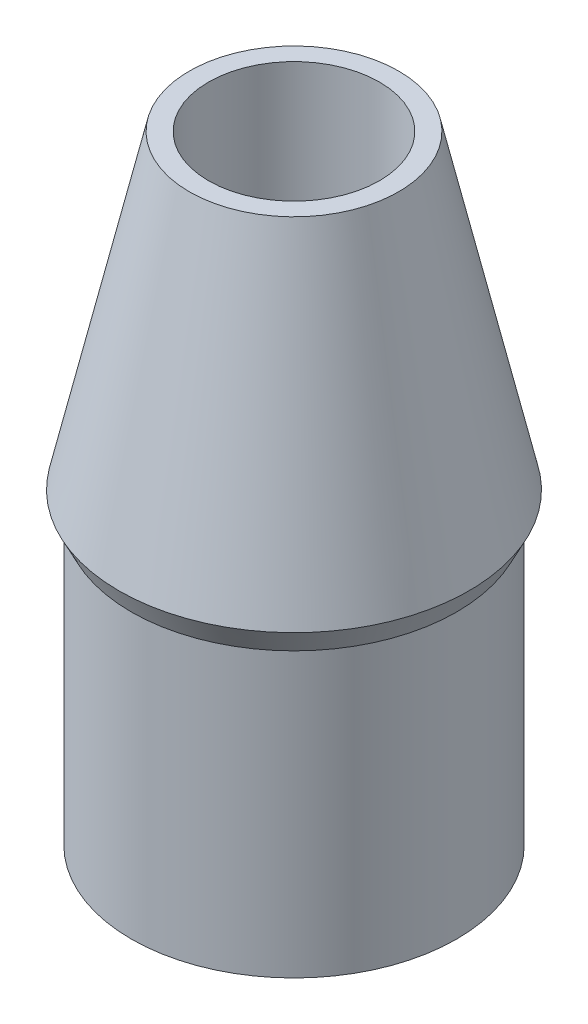
ISO-10303-21;
HEADER;
FILE_DESCRIPTION(('STEP AP214'),'2;1');
FILE_NAME('part.step','',(''),(''),'','','');
FILE_SCHEMA(('AUTOMOTIVE_DESIGN { 1 0 10303 214 1 1 1 1 }'));
ENDSEC;
DATA;
#1=APPLICATION_CONTEXT('core data for automotive mechanical design processes');
#2=APPLICATION_PROTOCOL_DEFINITION('international standard','automotive_design',2000,#1);
#3=PRODUCT_CONTEXT('',#1,'mechanical');
#4=PRODUCT('Part','Part','',(#3));
#5=PRODUCT_RELATED_PRODUCT_CATEGORY('part','',(#4));
#6=PRODUCT_DEFINITION_FORMATION('','',#4);
#7=PRODUCT_DEFINITION_CONTEXT('part definition',#1,'design');
#8=PRODUCT_DEFINITION('design','',#6,#7);
#9=PRODUCT_DEFINITION_SHAPE('','',#8);
#10=(LENGTH_UNIT() NAMED_UNIT(*) SI_UNIT(.MILLI.,.METRE.));
#11=(NAMED_UNIT(*) PLANE_ANGLE_UNIT() SI_UNIT($,.RADIAN.));
#12=(NAMED_UNIT(*) SI_UNIT($,.STERADIAN.) SOLID_ANGLE_UNIT());
#13=UNCERTAINTY_MEASURE_WITH_UNIT(LENGTH_MEASURE(1.E-05),#10,'distance_accuracy_value','');
#14=(GEOMETRIC_REPRESENTATION_CONTEXT(3) GLOBAL_UNCERTAINTY_ASSIGNED_CONTEXT((#13)) GLOBAL_UNIT_ASSIGNED_CONTEXT((#10,
#11,#12)) REPRESENTATION_CONTEXT('',''));
#15=CARTESIAN_POINT('',(0.,0.,0.));
#16=DIRECTION('',(0.,0.,1.));
#17=DIRECTION('',(1.,0.,0.));
#18=AXIS2_PLACEMENT_3D('',#15,#16,#17);
#19=CARTESIAN_POINT('',(5.15990187774307,16.51,0.));
#20=DIRECTION('',(0.,-1.,0.));
#21=DIRECTION('',(0.,0.,-1.));
#22=AXIS2_PLACEMENT_3D('',#19,#20,#21);
#23=PLANE('',#22);
#24=CARTESIAN_POINT('',(0.,16.51,0.));
#25=DIRECTION('',(0.,1.,0.));
#26=DIRECTION('',(0.,0.,1.));
#27=AXIS2_PLACEMENT_3D('',#24,#25,#26);
#28=CIRCLE('',#27,4.2164);
#29=CARTESIAN_POINT('',(0.,16.51,4.2164));
#30=VERTEX_POINT('',#29);
#31=EDGE_CURVE('E57',#30,#30,#28,.T.);
#32=ORIENTED_EDGE('',*,*,#31,.F.);
#33=EDGE_LOOP('',(#32));
#34=FACE_BOUND('',#33,.T.);
#35=CARTESIAN_POINT('',(0.,16.51,0.));
#36=DIRECTION('',(0.,1.,0.));
#37=DIRECTION('',(0.,0.,1.));
#38=AXIS2_PLACEMENT_3D('',#35,#36,#37);
#39=CIRCLE('',#38,5.15990187774307);
#40=CARTESIAN_POINT('',(0.,16.51,5.15990187774307));
#41=VERTEX_POINT('',#40);
#42=EDGE_CURVE('E11',#41,#41,#39,.T.);
#43=ORIENTED_EDGE('',*,*,#42,.T.);
#44=EDGE_LOOP('',(#43));
#45=FACE_BOUND('',#44,.T.);
#46=ADVANCED_FACE('F37',(#34,#45),#23,.F.);
#47=CARTESIAN_POINT('',(0.,1.20403255095323,0.));
#48=DIRECTION('',(0.,-1.,0.));
#49=DIRECTION('',(0.,0.,-1.));
#50=AXIS2_PLACEMENT_3D('',#47,#48,#49);
#51=CONICAL_SURFACE('',#50,8.63084342460048,0.222998968007678);
#52=ORIENTED_EDGE('',*,*,#42,.F.);
#53=EDGE_LOOP('',(#52));
#54=FACE_BOUND('',#53,.T.);
#55=CARTESIAN_POINT('',(0.,1.20403255095323,0.));
#56=DIRECTION('',(0.,1.,0.));
#57=DIRECTION('',(0.,0.,1.));
#58=AXIS2_PLACEMENT_3D('',#55,#56,#57);
#59=CIRCLE('',#58,8.63084342460048);
#60=CARTESIAN_POINT('',(0.,1.20403255095323,8.63084342460048));
#61=VERTEX_POINT('',#60);
#62=EDGE_CURVE('E43',#61,#61,#59,.T.);
#63=ORIENTED_EDGE('',*,*,#62,.T.);
#64=EDGE_LOOP('',(#63));
#65=FACE_BOUND('',#64,.T.);
#66=ADVANCED_FACE('F69',(#54,#65),#51,.T.);
#67=CARTESIAN_POINT('',(0.,0.,0.));
#68=DIRECTION('',(0.,1.,0.));
#69=DIRECTION('',(0.,0.,1.));
#70=AXIS2_PLACEMENT_3D('',#67,#68,#69);
#71=CONICAL_SURFACE('',#70,8.0264,0.465258988355768);
#72=ORIENTED_EDGE('',*,*,#62,.F.);
#73=EDGE_LOOP('',(#72));
#74=FACE_BOUND('',#73,.T.);
#75=CARTESIAN_POINT('',(0.,0.,0.));
#76=DIRECTION('',(0.,1.,0.));
#77=DIRECTION('',(0.,0.,1.));
#78=AXIS2_PLACEMENT_3D('',#75,#76,#77);
#79=CIRCLE('',#78,8.0264);
#80=CARTESIAN_POINT('',(0.,0.,8.0264));
#81=VERTEX_POINT('',#80);
#82=EDGE_CURVE('E60',#81,#81,#79,.T.);
#83=ORIENTED_EDGE('',*,*,#82,.T.);
#84=EDGE_LOOP('',(#83));
#85=FACE_BOUND('',#84,.T.);
#86=ADVANCED_FACE('F71',(#74,#85),#71,.T.);
#87=CARTESIAN_POINT('',(0.,16.51,0.));
#88=DIRECTION('',(0.,1.,0.));
#89=DIRECTION('',(0.,0.,1.));
#90=AXIS2_PLACEMENT_3D('',#87,#88,#89);
#91=CYLINDRICAL_SURFACE('',#90,8.0264);
#92=ORIENTED_EDGE('',*,*,#82,.F.);
#93=EDGE_LOOP('',(#92));
#94=FACE_BOUND('',#93,.T.);
#95=CARTESIAN_POINT('',(0.,-13.97,0.));
#96=DIRECTION('',(0.,1.,0.));
#97=DIRECTION('',(0.,0.,1.));
#98=AXIS2_PLACEMENT_3D('',#95,#96,#97);
#99=CIRCLE('',#98,8.0264);
#100=CARTESIAN_POINT('',(0.,-13.97,8.0264));
#101=VERTEX_POINT('',#100);
#102=EDGE_CURVE('E56',#101,#101,#99,.T.);
#103=ORIENTED_EDGE('',*,*,#102,.T.);
#104=EDGE_LOOP('',(#103));
#105=FACE_BOUND('',#104,.T.);
#106=ADVANCED_FACE('F74',(#94,#105),#91,.T.);
#107=CARTESIAN_POINT('',(8.0264,-13.97,0.));
#108=DIRECTION('',(0.,1.,0.));
#109=DIRECTION('',(0.,0.,1.));
#110=AXIS2_PLACEMENT_3D('',#107,#108,#109);
#111=PLANE('',#110);
#112=ORIENTED_EDGE('',*,*,#102,.F.);
#113=EDGE_LOOP('',(#112));
#114=FACE_BOUND('',#113,.T.);
#115=ADVANCED_FACE('F50',(#114),#111,.F.);
#116=CARTESIAN_POINT('',(0.,-7.8359,0.));
#117=DIRECTION('',(0.,1.,0.));
#118=DIRECTION('',(0.,0.,1.));
#119=AXIS2_PLACEMENT_3D('',#116,#117,#118);
#120=CONICAL_SURFACE('',#119,4.21639999999999,1.02974425867665);
#121=CARTESIAN_POINT('',(0.,-10.3693687140678,0.));
#122=VERTEX_POINT('',#121);
#123=VERTEX_LOOP('',#122);
#124=FACE_BOUND('',#123,.T.);
#125=CARTESIAN_POINT('',(0.,-7.8359,0.));
#126=DIRECTION('',(0.,1.,0.));
#127=DIRECTION('',(0.,0.,1.));
#128=AXIS2_PLACEMENT_3D('',#125,#126,#127);
#129=CIRCLE('',#128,4.21639999999999);
#130=CARTESIAN_POINT('',(0.,-7.8359,4.21639999999999));
#131=VERTEX_POINT('',#130);
#132=EDGE_CURVE('E54',#131,#131,#129,.T.);
#133=ORIENTED_EDGE('',*,*,#132,.T.);
#134=EDGE_LOOP('',(#133));
#135=FACE_BOUND('',#134,.T.);
#136=ADVANCED_FACE('F46',(#124,#135),#120,.F.);
#137=CARTESIAN_POINT('',(0.,16.51,0.));
#138=DIRECTION('',(0.,1.,0.));
#139=DIRECTION('',(0.,0.,1.));
#140=AXIS2_PLACEMENT_3D('',#137,#138,#139);
#141=CYLINDRICAL_SURFACE('',#140,4.2164);
#142=ORIENTED_EDGE('',*,*,#132,.F.);
#143=EDGE_LOOP('',(#142));
#144=FACE_BOUND('',#143,.T.);
#145=ORIENTED_EDGE('',*,*,#31,.T.);
#146=EDGE_LOOP('',(#145));
#147=FACE_BOUND('',#146,.T.);
#148=ADVANCED_FACE('F49',(#144,#147),#141,.F.);
#149=CLOSED_SHELL('',(#46,#66,#86,#106,#115,#136,#148));
#150=MANIFOLD_SOLID_BREP('B2',#149);
#151=ADVANCED_BREP_SHAPE_REPRESENTATION('',(#18,#150),#14);
#152=SHAPE_DEFINITION_REPRESENTATION(#9,#151);
ENDSEC;
END-ISO-10303-21;
